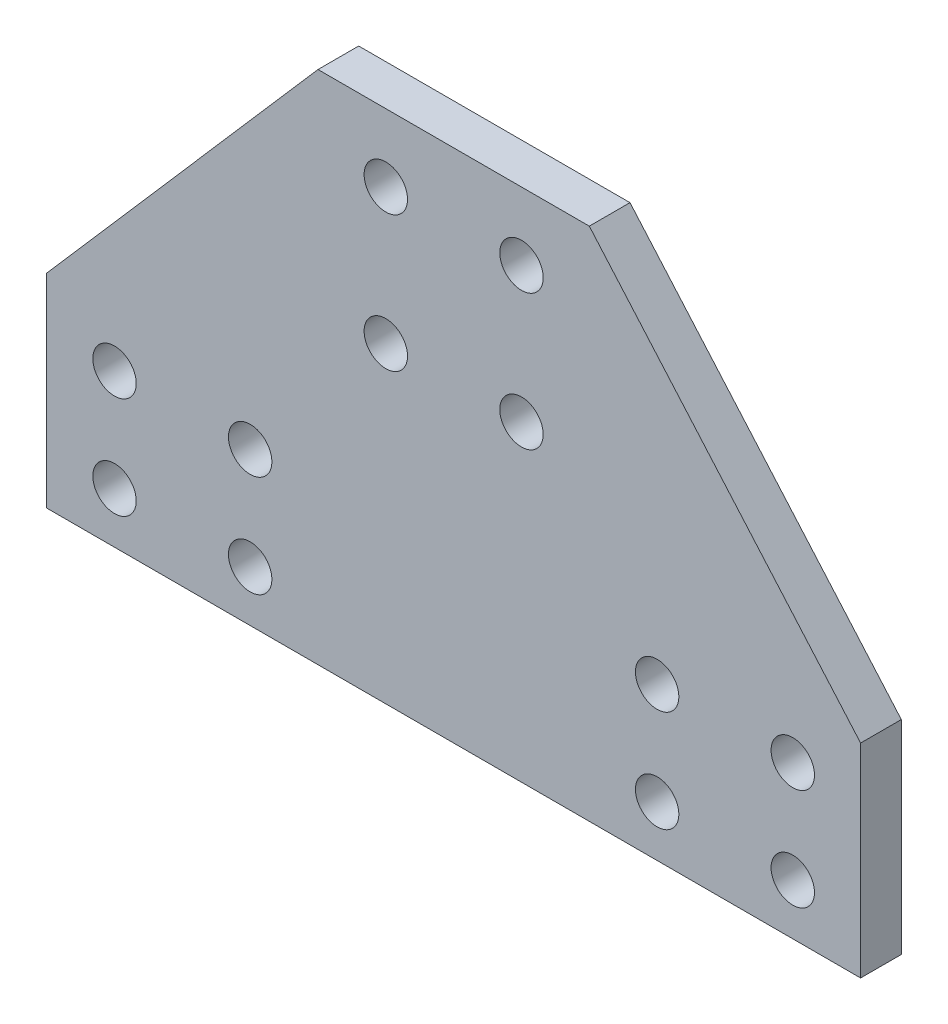
ISO-10303-21;
HEADER;
FILE_DESCRIPTION(('STEP AP214'),'2;1');
FILE_NAME('part.step','',(''),(''),'','','');
FILE_SCHEMA(('AUTOMOTIVE_DESIGN { 1 0 10303 214 1 1 1 1 }'));
ENDSEC;
DATA;
#1=APPLICATION_CONTEXT('core data for automotive mechanical design processes');
#2=APPLICATION_PROTOCOL_DEFINITION('international standard','automotive_design',2000,#1);
#3=PRODUCT_CONTEXT('',#1,'mechanical');
#4=PRODUCT('Part','Part','',(#3));
#5=PRODUCT_RELATED_PRODUCT_CATEGORY('part','',(#4));
#6=PRODUCT_DEFINITION_FORMATION('','',#4);
#7=PRODUCT_DEFINITION_CONTEXT('part definition',#1,'design');
#8=PRODUCT_DEFINITION('design','',#6,#7);
#9=PRODUCT_DEFINITION_SHAPE('','',#8);
#10=(LENGTH_UNIT() NAMED_UNIT(*) SI_UNIT(.MILLI.,.METRE.));
#11=(NAMED_UNIT(*) PLANE_ANGLE_UNIT() SI_UNIT($,.RADIAN.));
#12=(NAMED_UNIT(*) SI_UNIT($,.STERADIAN.) SOLID_ANGLE_UNIT());
#13=UNCERTAINTY_MEASURE_WITH_UNIT(LENGTH_MEASURE(1.E-05),#10,'distance_accuracy_value','');
#14=(GEOMETRIC_REPRESENTATION_CONTEXT(3) GLOBAL_UNCERTAINTY_ASSIGNED_CONTEXT((#13)) GLOBAL_UNIT_ASSIGNED_CONTEXT((#10,
#11,#12)) REPRESENTATION_CONTEXT('',''));
#15=CARTESIAN_POINT('',(0.,0.,0.));
#16=DIRECTION('',(0.,0.,1.));
#17=DIRECTION('',(1.,0.,0.));
#18=AXIS2_PLACEMENT_3D('',#15,#16,#17);
#19=CARTESIAN_POINT('',(-20.,-23.,3.));
#20=DIRECTION('',(0.754605522163505,-0.656178714924786,0.));
#21=DIRECTION('',(0.656178714924786,0.754605522163505,0.));
#22=AXIS2_PLACEMENT_3D('',#19,#20,#21);
#23=PLANE('',#22);
#24=DIRECTION('',(-0.656178714924787,-0.754605522163505,0.));
#25=VECTOR('',#24,1.);
#26=CARTESIAN_POINT('',(-20.,-23.,0.));
#27=LINE('',#26,#25);
#28=CARTESIAN_POINT('',(0.,0.,0.));
#29=VERTEX_POINT('',#28);
#30=CARTESIAN_POINT('',(-20.,-23.,0.));
#31=VERTEX_POINT('',#30);
#32=EDGE_CURVE('E132',#29,#31,#27,.T.);
#33=ORIENTED_EDGE('',*,*,#32,.T.);
#34=DIRECTION('',(0.,0.,-1.));
#35=VECTOR('',#34,1.);
#36=CARTESIAN_POINT('',(-20.,-23.,3.));
#37=LINE('',#36,#35);
#38=CARTESIAN_POINT('',(-20.,-23.,3.));
#39=VERTEX_POINT('',#38);
#40=EDGE_CURVE('E11',#39,#31,#37,.T.);
#41=ORIENTED_EDGE('',*,*,#40,.F.);
#42=DIRECTION('',(-0.656178714924787,-0.754605522163505,0.));
#43=VECTOR('',#42,1.);
#44=CARTESIAN_POINT('',(-20.,-23.,3.));
#45=LINE('',#44,#43);
#46=CARTESIAN_POINT('',(0.,0.,3.));
#47=VERTEX_POINT('',#46);
#48=EDGE_CURVE('E149',#47,#39,#45,.T.);
#49=ORIENTED_EDGE('',*,*,#48,.F.);
#50=DIRECTION('',(0.,0.,-1.));
#51=VECTOR('',#50,1.);
#52=CARTESIAN_POINT('',(0.,0.,3.));
#53=LINE('',#52,#51);
#54=EDGE_CURVE('E128',#47,#29,#53,.T.);
#55=ORIENTED_EDGE('',*,*,#54,.T.);
#56=EDGE_LOOP('',(#33,#41,#49,#55));
#57=FACE_BOUND('',#56,.T.);
#58=ADVANCED_FACE('F43',(#57),#23,.F.);
#59=CARTESIAN_POINT('',(-20.,-38.,3.));
#60=DIRECTION('',(1.,0.,0.));
#61=DIRECTION('',(0.,0.,-1.));
#62=AXIS2_PLACEMENT_3D('',#59,#60,#61);
#63=PLANE('',#62);
#64=DIRECTION('',(0.,-1.,0.));
#65=VECTOR('',#64,1.);
#66=CARTESIAN_POINT('',(-20.,-38.,0.));
#67=LINE('',#66,#65);
#68=CARTESIAN_POINT('',(-20.,-38.,0.));
#69=VERTEX_POINT('',#68);
#70=EDGE_CURVE('E136',#31,#69,#67,.T.);
#71=ORIENTED_EDGE('',*,*,#70,.T.);
#72=DIRECTION('',(0.,0.,-1.));
#73=VECTOR('',#72,1.);
#74=CARTESIAN_POINT('',(-20.,-38.,3.));
#75=LINE('',#74,#73);
#76=CARTESIAN_POINT('',(-20.,-38.,3.));
#77=VERTEX_POINT('',#76);
#78=EDGE_CURVE('E52',#77,#69,#75,.T.);
#79=ORIENTED_EDGE('',*,*,#78,.F.);
#80=DIRECTION('',(0.,-1.,0.));
#81=VECTOR('',#80,1.);
#82=CARTESIAN_POINT('',(-20.,-38.,3.));
#83=LINE('',#82,#81);
#84=EDGE_CURVE('E97',#39,#77,#83,.T.);
#85=ORIENTED_EDGE('',*,*,#84,.F.);
#86=ORIENTED_EDGE('',*,*,#40,.T.);
#87=EDGE_LOOP('',(#71,#79,#85,#86));
#88=FACE_BOUND('',#87,.T.);
#89=ADVANCED_FACE('F178',(#88),#63,.F.);
#90=CARTESIAN_POINT('',(40.,-38.,3.));
#91=DIRECTION('',(0.,1.,0.));
#92=DIRECTION('',(-1.,0.,0.));
#93=AXIS2_PLACEMENT_3D('',#90,#91,#92);
#94=PLANE('',#93);
#95=DIRECTION('',(1.,0.,0.));
#96=VECTOR('',#95,1.);
#97=CARTESIAN_POINT('',(40.,-38.,0.));
#98=LINE('',#97,#96);
#99=CARTESIAN_POINT('',(40.,-38.,0.));
#100=VERTEX_POINT('',#99);
#101=EDGE_CURVE('E140',#69,#100,#98,.T.);
#102=ORIENTED_EDGE('',*,*,#101,.T.);
#103=DIRECTION('',(0.,0.,-1.));
#104=VECTOR('',#103,1.);
#105=CARTESIAN_POINT('',(40.,-38.,3.));
#106=LINE('',#105,#104);
#107=CARTESIAN_POINT('',(40.,-38.,3.));
#108=VERTEX_POINT('',#107);
#109=EDGE_CURVE('E121',#108,#100,#106,.T.);
#110=ORIENTED_EDGE('',*,*,#109,.F.);
#111=DIRECTION('',(1.,0.,0.));
#112=VECTOR('',#111,1.);
#113=CARTESIAN_POINT('',(40.,-38.,3.));
#114=LINE('',#113,#112);
#115=EDGE_CURVE('E110',#77,#108,#114,.T.);
#116=ORIENTED_EDGE('',*,*,#115,.F.);
#117=ORIENTED_EDGE('',*,*,#78,.T.);
#118=EDGE_LOOP('',(#102,#110,#116,#117));
#119=FACE_BOUND('',#118,.T.);
#120=ADVANCED_FACE('F159',(#119),#94,.F.);
#121=CARTESIAN_POINT('',(40.,-23.,3.));
#122=DIRECTION('',(-1.,0.,0.));
#123=DIRECTION('',(0.,-1.,0.));
#124=AXIS2_PLACEMENT_3D('',#121,#122,#123);
#125=PLANE('',#124);
#126=DIRECTION('',(0.,1.,0.));
#127=VECTOR('',#126,1.);
#128=CARTESIAN_POINT('',(40.,-23.,0.));
#129=LINE('',#128,#127);
#130=CARTESIAN_POINT('',(40.,-23.,0.));
#131=VERTEX_POINT('',#130);
#132=EDGE_CURVE('E119',#100,#131,#129,.T.);
#133=ORIENTED_EDGE('',*,*,#132,.T.);
#134=DIRECTION('',(0.,0.,-1.));
#135=VECTOR('',#134,1.);
#136=CARTESIAN_POINT('',(40.,-23.,3.));
#137=LINE('',#136,#135);
#138=CARTESIAN_POINT('',(40.,-23.,3.));
#139=VERTEX_POINT('',#138);
#140=EDGE_CURVE('E116',#139,#131,#137,.T.);
#141=ORIENTED_EDGE('',*,*,#140,.F.);
#142=DIRECTION('',(0.,1.,0.));
#143=VECTOR('',#142,1.);
#144=CARTESIAN_POINT('',(40.,-23.,3.));
#145=LINE('',#144,#143);
#146=EDGE_CURVE('E104',#108,#139,#145,.T.);
#147=ORIENTED_EDGE('',*,*,#146,.F.);
#148=ORIENTED_EDGE('',*,*,#109,.T.);
#149=EDGE_LOOP('',(#133,#141,#147,#148));
#150=FACE_BOUND('',#149,.T.);
#151=ADVANCED_FACE('F117',(#150),#125,.F.);
#152=CARTESIAN_POINT('',(20.,0.,3.));
#153=DIRECTION('',(-0.754605522163505,-0.656178714924786,0.));
#154=DIRECTION('',(0.656178714924786,-0.754605522163505,0.));
#155=AXIS2_PLACEMENT_3D('',#152,#153,#154);
#156=PLANE('',#155);
#157=DIRECTION('',(-0.656178714924787,0.754605522163505,0.));
#158=VECTOR('',#157,1.);
#159=CARTESIAN_POINT('',(20.,0.,0.));
#160=LINE('',#159,#158);
#161=CARTESIAN_POINT('',(20.,0.,0.));
#162=VERTEX_POINT('',#161);
#163=EDGE_CURVE('E83',#131,#162,#160,.T.);
#164=ORIENTED_EDGE('',*,*,#163,.T.);
#165=DIRECTION('',(0.,0.,-1.));
#166=VECTOR('',#165,1.);
#167=CARTESIAN_POINT('',(20.,0.,3.));
#168=LINE('',#167,#166);
#169=CARTESIAN_POINT('',(20.,0.,3.));
#170=VERTEX_POINT('',#169);
#171=EDGE_CURVE('E122',#170,#162,#168,.T.);
#172=ORIENTED_EDGE('',*,*,#171,.F.);
#173=DIRECTION('',(-0.656178714924787,0.754605522163505,0.));
#174=VECTOR('',#173,1.);
#175=CARTESIAN_POINT('',(20.,0.,3.));
#176=LINE('',#175,#174);
#177=EDGE_CURVE('E108',#139,#170,#176,.T.);
#178=ORIENTED_EDGE('',*,*,#177,.F.);
#179=ORIENTED_EDGE('',*,*,#140,.T.);
#180=EDGE_LOOP('',(#164,#172,#178,#179));
#181=FACE_BOUND('',#180,.T.);
#182=ADVANCED_FACE('F124',(#181),#156,.F.);
#183=CARTESIAN_POINT('',(0.,0.,3.));
#184=DIRECTION('',(0.,-1.,0.));
#185=DIRECTION('',(1.,0.,0.));
#186=AXIS2_PLACEMENT_3D('',#183,#184,#185);
#187=PLANE('',#186);
#188=DIRECTION('',(-1.,0.,0.));
#189=VECTOR('',#188,1.);
#190=CARTESIAN_POINT('',(0.,0.,0.));
#191=LINE('',#190,#189);
#192=EDGE_CURVE('E89',#162,#29,#191,.T.);
#193=ORIENTED_EDGE('',*,*,#192,.T.);
#194=ORIENTED_EDGE('',*,*,#54,.F.);
#195=DIRECTION('',(-1.,0.,0.));
#196=VECTOR('',#195,1.);
#197=CARTESIAN_POINT('',(0.,0.,3.));
#198=LINE('',#197,#196);
#199=EDGE_CURVE('E60',#170,#47,#198,.T.);
#200=ORIENTED_EDGE('',*,*,#199,.F.);
#201=ORIENTED_EDGE('',*,*,#171,.T.);
#202=EDGE_LOOP('',(#193,#194,#200,#201));
#203=FACE_BOUND('',#202,.T.);
#204=ADVANCED_FACE('F166',(#203),#187,.F.);
#205=CARTESIAN_POINT('',(0.,0.,3.));
#206=DIRECTION('',(0.,0.,-1.));
#207=DIRECTION('',(-1.,0.,0.));
#208=AXIS2_PLACEMENT_3D('',#205,#206,#207);
#209=PLANE('',#208);
#210=CARTESIAN_POINT('',(35.,-34.25,3.));
#211=DIRECTION('',(0.,0.,1.));
#212=DIRECTION('',(-1.,0.,0.));
#213=AXIS2_PLACEMENT_3D('',#210,#211,#212);
#214=CIRCLE('',#213,1.6);
#215=CARTESIAN_POINT('',(33.4,-34.25,3.));
#216=VERTEX_POINT('',#215);
#217=EDGE_CURVE('E398',#216,#216,#214,.T.);
#218=ORIENTED_EDGE('',*,*,#217,.F.);
#219=EDGE_LOOP('',(#218));
#220=FACE_BOUND('',#219,.T.);
#221=CARTESIAN_POINT('',(25.,-26.75,3.));
#222=DIRECTION('',(0.,0.,1.));
#223=DIRECTION('',(-1.,0.,0.));
#224=AXIS2_PLACEMENT_3D('',#221,#222,#223);
#225=CIRCLE('',#224,1.6);
#226=CARTESIAN_POINT('',(23.4,-26.75,3.));
#227=VERTEX_POINT('',#226);
#228=EDGE_CURVE('E407',#227,#227,#225,.T.);
#229=ORIENTED_EDGE('',*,*,#228,.F.);
#230=EDGE_LOOP('',(#229));
#231=FACE_BOUND('',#230,.T.);
#232=CARTESIAN_POINT('',(35.,-26.75,3.));
#233=DIRECTION('',(0.,0.,1.));
#234=DIRECTION('',(1.,0.,0.));
#235=AXIS2_PLACEMENT_3D('',#232,#233,#234);
#236=CIRCLE('',#235,1.6);
#237=CARTESIAN_POINT('',(36.6,-26.75,3.));
#238=VERTEX_POINT('',#237);
#239=EDGE_CURVE('E420',#238,#238,#236,.T.);
#240=ORIENTED_EDGE('',*,*,#239,.F.);
#241=EDGE_LOOP('',(#240));
#242=FACE_BOUND('',#241,.T.);
#243=CARTESIAN_POINT('',(5.,-5.,3.));
#244=DIRECTION('',(0.,0.,1.));
#245=DIRECTION('',(1.,0.,0.));
#246=AXIS2_PLACEMENT_3D('',#243,#244,#245);
#247=CIRCLE('',#246,1.6);
#248=CARTESIAN_POINT('',(6.6,-5.,3.));
#249=VERTEX_POINT('',#248);
#250=EDGE_CURVE('E505',#249,#249,#247,.T.);
#251=ORIENTED_EDGE('',*,*,#250,.F.);
#252=EDGE_LOOP('',(#251));
#253=FACE_BOUND('',#252,.T.);
#254=CARTESIAN_POINT('',(-15.,-26.75,3.));
#255=DIRECTION('',(0.,0.,1.));
#256=DIRECTION('',(-1.,0.,0.));
#257=AXIS2_PLACEMENT_3D('',#254,#255,#256);
#258=CIRCLE('',#257,1.6);
#259=CARTESIAN_POINT('',(-16.6,-26.75,3.));
#260=VERTEX_POINT('',#259);
#261=EDGE_CURVE('E433',#260,#260,#258,.T.);
#262=ORIENTED_EDGE('',*,*,#261,.F.);
#263=EDGE_LOOP('',(#262));
#264=FACE_BOUND('',#263,.T.);
#265=CARTESIAN_POINT('',(-4.99999999999999,-34.25,3.));
#266=DIRECTION('',(0.,0.,1.));
#267=DIRECTION('',(-1.,0.,0.));
#268=AXIS2_PLACEMENT_3D('',#265,#266,#267);
#269=CIRCLE('',#268,1.6);
#270=CARTESIAN_POINT('',(-6.59999999999998,-34.25,3.));
#271=VERTEX_POINT('',#270);
#272=EDGE_CURVE('E442',#271,#271,#269,.T.);
#273=ORIENTED_EDGE('',*,*,#272,.F.);
#274=EDGE_LOOP('',(#273));
#275=FACE_BOUND('',#274,.T.);
#276=CARTESIAN_POINT('',(-4.99999999999998,-26.75,3.));
#277=DIRECTION('',(0.,0.,1.));
#278=DIRECTION('',(1.,0.,0.));
#279=AXIS2_PLACEMENT_3D('',#276,#277,#278);
#280=CIRCLE('',#279,1.6);
#281=CARTESIAN_POINT('',(-3.39999999999999,-26.75,3.));
#282=VERTEX_POINT('',#281);
#283=EDGE_CURVE('E421',#282,#282,#280,.T.);
#284=ORIENTED_EDGE('',*,*,#283,.F.);
#285=EDGE_LOOP('',(#284));
#286=FACE_BOUND('',#285,.T.);
#287=CARTESIAN_POINT('',(25.,-34.25,3.));
#288=DIRECTION('',(0.,0.,1.));
#289=DIRECTION('',(1.,0.,0.));
#290=AXIS2_PLACEMENT_3D('',#287,#288,#289);
#291=CIRCLE('',#290,1.59999999999999);
#292=CARTESIAN_POINT('',(26.6,-34.25,3.));
#293=VERTEX_POINT('',#292);
#294=EDGE_CURVE('E405',#293,#293,#291,.T.);
#295=ORIENTED_EDGE('',*,*,#294,.F.);
#296=EDGE_LOOP('',(#295));
#297=FACE_BOUND('',#296,.T.);
#298=CARTESIAN_POINT('',(15.,-5.,3.));
#299=DIRECTION('',(0.,0.,1.));
#300=DIRECTION('',(-1.,0.,0.));
#301=AXIS2_PLACEMENT_3D('',#298,#299,#300);
#302=CIRCLE('',#301,1.6);
#303=CARTESIAN_POINT('',(13.4,-5.,3.));
#304=VERTEX_POINT('',#303);
#305=EDGE_CURVE('E478',#304,#304,#302,.T.);
#306=ORIENTED_EDGE('',*,*,#305,.F.);
#307=EDGE_LOOP('',(#306));
#308=FACE_BOUND('',#307,.T.);
#309=CARTESIAN_POINT('',(15.,-15.,3.));
#310=DIRECTION('',(0.,0.,1.));
#311=DIRECTION('',(1.,0.,0.));
#312=AXIS2_PLACEMENT_3D('',#309,#310,#311);
#313=CIRCLE('',#312,1.6);
#314=CARTESIAN_POINT('',(16.6,-15.,3.));
#315=VERTEX_POINT('',#314);
#316=EDGE_CURVE('E482',#315,#315,#313,.T.);
#317=ORIENTED_EDGE('',*,*,#316,.F.);
#318=EDGE_LOOP('',(#317));
#319=FACE_BOUND('',#318,.T.);
#320=CARTESIAN_POINT('',(5.,-15.,3.));
#321=DIRECTION('',(0.,0.,1.));
#322=DIRECTION('',(-1.,0.,0.));
#323=AXIS2_PLACEMENT_3D('',#320,#321,#322);
#324=CIRCLE('',#323,1.6);
#325=CARTESIAN_POINT('',(3.4,-15.,3.));
#326=VERTEX_POINT('',#325);
#327=EDGE_CURVE('E485',#326,#326,#324,.T.);
#328=ORIENTED_EDGE('',*,*,#327,.F.);
#329=EDGE_LOOP('',(#328));
#330=FACE_BOUND('',#329,.T.);
#331=CARTESIAN_POINT('',(-15.,-34.25,3.));
#332=DIRECTION('',(0.,0.,1.));
#333=DIRECTION('',(1.,0.,0.));
#334=AXIS2_PLACEMENT_3D('',#331,#332,#333);
#335=CIRCLE('',#334,1.6);
#336=CARTESIAN_POINT('',(-13.4,-34.25,3.));
#337=VERTEX_POINT('',#336);
#338=EDGE_CURVE('E437',#337,#337,#335,.T.);
#339=ORIENTED_EDGE('',*,*,#338,.F.);
#340=EDGE_LOOP('',(#339));
#341=FACE_BOUND('',#340,.T.);
#342=ORIENTED_EDGE('',*,*,#48,.T.);
#343=ORIENTED_EDGE('',*,*,#84,.T.);
#344=ORIENTED_EDGE('',*,*,#115,.T.);
#345=ORIENTED_EDGE('',*,*,#146,.T.);
#346=ORIENTED_EDGE('',*,*,#177,.T.);
#347=ORIENTED_EDGE('',*,*,#199,.T.);
#348=EDGE_LOOP('',(#342,#343,#344,#345,#346,#347));
#349=FACE_BOUND('',#348,.T.);
#350=ADVANCED_FACE('F106',(#220,#231,#242,#253,#264,#275,#286,#297,#308,#319,#330,#341,#349),
#209,.F.);
#351=CARTESIAN_POINT('',(0.,0.,0.));
#352=DIRECTION('',(0.,0.,-1.));
#353=DIRECTION('',(-1.,0.,0.));
#354=AXIS2_PLACEMENT_3D('',#351,#352,#353);
#355=PLANE('',#354);
#356=CARTESIAN_POINT('',(35.,-34.25,0.));
#357=DIRECTION('',(0.,0.,1.));
#358=DIRECTION('',(-1.,0.,0.));
#359=AXIS2_PLACEMENT_3D('',#356,#357,#358);
#360=CIRCLE('',#359,1.6);
#361=CARTESIAN_POINT('',(33.4,-34.25,0.));
#362=VERTEX_POINT('',#361);
#363=EDGE_CURVE('E395',#362,#362,#360,.T.);
#364=ORIENTED_EDGE('',*,*,#363,.T.);
#365=EDGE_LOOP('',(#364));
#366=FACE_BOUND('',#365,.T.);
#367=CARTESIAN_POINT('',(25.,-26.75,0.));
#368=DIRECTION('',(0.,0.,1.));
#369=DIRECTION('',(-1.,0.,0.));
#370=AXIS2_PLACEMENT_3D('',#367,#368,#369);
#371=CIRCLE('',#370,1.6);
#372=CARTESIAN_POINT('',(23.4,-26.75,0.));
#373=VERTEX_POINT('',#372);
#374=EDGE_CURVE('E416',#373,#373,#371,.T.);
#375=ORIENTED_EDGE('',*,*,#374,.T.);
#376=EDGE_LOOP('',(#375));
#377=FACE_BOUND('',#376,.T.);
#378=CARTESIAN_POINT('',(35.,-26.75,0.));
#379=DIRECTION('',(0.,0.,1.));
#380=DIRECTION('',(1.,0.,0.));
#381=AXIS2_PLACEMENT_3D('',#378,#379,#380);
#382=CIRCLE('',#381,1.6);
#383=CARTESIAN_POINT('',(36.6,-26.75,0.));
#384=VERTEX_POINT('',#383);
#385=EDGE_CURVE('E502',#384,#384,#382,.T.);
#386=ORIENTED_EDGE('',*,*,#385,.T.);
#387=EDGE_LOOP('',(#386));
#388=FACE_BOUND('',#387,.T.);
#389=CARTESIAN_POINT('',(5.,-5.,0.));
#390=DIRECTION('',(0.,0.,1.));
#391=DIRECTION('',(1.,0.,0.));
#392=AXIS2_PLACEMENT_3D('',#389,#390,#391);
#393=CIRCLE('',#392,1.6);
#394=CARTESIAN_POINT('',(6.6,-5.,0.));
#395=VERTEX_POINT('',#394);
#396=EDGE_CURVE('E410',#395,#395,#393,.T.);
#397=ORIENTED_EDGE('',*,*,#396,.T.);
#398=EDGE_LOOP('',(#397));
#399=FACE_BOUND('',#398,.T.);
#400=CARTESIAN_POINT('',(-15.,-26.75,0.));
#401=DIRECTION('',(0.,0.,1.));
#402=DIRECTION('',(-1.,0.,0.));
#403=AXIS2_PLACEMENT_3D('',#400,#401,#402);
#404=CIRCLE('',#403,1.6);
#405=CARTESIAN_POINT('',(-16.6,-26.75,0.));
#406=VERTEX_POINT('',#405);
#407=EDGE_CURVE('E438',#406,#406,#404,.T.);
#408=ORIENTED_EDGE('',*,*,#407,.T.);
#409=EDGE_LOOP('',(#408));
#410=FACE_BOUND('',#409,.T.);
#411=CARTESIAN_POINT('',(-4.99999999999999,-34.25,0.));
#412=DIRECTION('',(0.,0.,1.));
#413=DIRECTION('',(-1.,0.,0.));
#414=AXIS2_PLACEMENT_3D('',#411,#412,#413);
#415=CIRCLE('',#414,1.6);
#416=CARTESIAN_POINT('',(-6.59999999999998,-34.25,0.));
#417=VERTEX_POINT('',#416);
#418=EDGE_CURVE('E425',#417,#417,#415,.T.);
#419=ORIENTED_EDGE('',*,*,#418,.T.);
#420=EDGE_LOOP('',(#419));
#421=FACE_BOUND('',#420,.T.);
#422=CARTESIAN_POINT('',(-4.99999999999998,-26.75,0.));
#423=DIRECTION('',(0.,0.,1.));
#424=DIRECTION('',(1.,0.,0.));
#425=AXIS2_PLACEMENT_3D('',#422,#423,#424);
#426=CIRCLE('',#425,1.6);
#427=CARTESIAN_POINT('',(-3.39999999999999,-26.75,0.));
#428=VERTEX_POINT('',#427);
#429=EDGE_CURVE('E426',#428,#428,#426,.T.);
#430=ORIENTED_EDGE('',*,*,#429,.T.);
#431=EDGE_LOOP('',(#430));
#432=FACE_BOUND('',#431,.T.);
#433=CARTESIAN_POINT('',(25.,-34.25,0.));
#434=DIRECTION('',(0.,0.,1.));
#435=DIRECTION('',(1.,0.,0.));
#436=AXIS2_PLACEMENT_3D('',#433,#434,#435);
#437=CIRCLE('',#436,1.59999999999999);
#438=CARTESIAN_POINT('',(26.6,-34.25,0.));
#439=VERTEX_POINT('',#438);
#440=EDGE_CURVE('E400',#439,#439,#437,.T.);
#441=ORIENTED_EDGE('',*,*,#440,.T.);
#442=EDGE_LOOP('',(#441));
#443=FACE_BOUND('',#442,.T.);
#444=CARTESIAN_POINT('',(15.,-5.,0.));
#445=DIRECTION('',(0.,0.,1.));
#446=DIRECTION('',(-1.,0.,0.));
#447=AXIS2_PLACEMENT_3D('',#444,#445,#446);
#448=CIRCLE('',#447,1.6);
#449=CARTESIAN_POINT('',(13.4,-5.,0.));
#450=VERTEX_POINT('',#449);
#451=EDGE_CURVE('E515',#450,#450,#448,.T.);
#452=ORIENTED_EDGE('',*,*,#451,.T.);
#453=EDGE_LOOP('',(#452));
#454=FACE_BOUND('',#453,.T.);
#455=CARTESIAN_POINT('',(15.,-15.,0.));
#456=DIRECTION('',(0.,0.,1.));
#457=DIRECTION('',(1.,0.,0.));
#458=AXIS2_PLACEMENT_3D('',#455,#456,#457);
#459=CIRCLE('',#458,1.6);
#460=CARTESIAN_POINT('',(16.6,-15.,0.));
#461=VERTEX_POINT('',#460);
#462=EDGE_CURVE('E488',#461,#461,#459,.T.);
#463=ORIENTED_EDGE('',*,*,#462,.T.);
#464=EDGE_LOOP('',(#463));
#465=FACE_BOUND('',#464,.T.);
#466=CARTESIAN_POINT('',(5.,-15.,0.));
#467=DIRECTION('',(0.,0.,1.));
#468=DIRECTION('',(-1.,0.,0.));
#469=AXIS2_PLACEMENT_3D('',#466,#467,#468);
#470=CIRCLE('',#469,1.6);
#471=CARTESIAN_POINT('',(3.4,-15.,0.));
#472=VERTEX_POINT('',#471);
#473=EDGE_CURVE('E489',#472,#472,#470,.T.);
#474=ORIENTED_EDGE('',*,*,#473,.T.);
#475=EDGE_LOOP('',(#474));
#476=FACE_BOUND('',#475,.T.);
#477=CARTESIAN_POINT('',(-15.,-34.25,0.));
#478=DIRECTION('',(0.,0.,1.));
#479=DIRECTION('',(1.,0.,0.));
#480=AXIS2_PLACEMENT_3D('',#477,#478,#479);
#481=CIRCLE('',#480,1.6);
#482=CARTESIAN_POINT('',(-13.4,-34.25,0.));
#483=VERTEX_POINT('',#482);
#484=EDGE_CURVE('E137',#483,#483,#481,.T.);
#485=ORIENTED_EDGE('',*,*,#484,.T.);
#486=EDGE_LOOP('',(#485));
#487=FACE_BOUND('',#486,.T.);
#488=ORIENTED_EDGE('',*,*,#32,.F.);
#489=ORIENTED_EDGE('',*,*,#192,.F.);
#490=ORIENTED_EDGE('',*,*,#163,.F.);
#491=ORIENTED_EDGE('',*,*,#132,.F.);
#492=ORIENTED_EDGE('',*,*,#101,.F.);
#493=ORIENTED_EDGE('',*,*,#70,.F.);
#494=EDGE_LOOP('',(#488,#489,#490,#491,#492,#493));
#495=FACE_BOUND('',#494,.T.);
#496=ADVANCED_FACE('F162',(#366,#377,#388,#399,#410,#421,#432,#443,#454,#465,#476,#487,#495),
#355,.T.);
#497=CARTESIAN_POINT('',(-15.,-34.25,0.));
#498=DIRECTION('',(0.,0.,1.));
#499=DIRECTION('',(1.,0.,0.));
#500=AXIS2_PLACEMENT_3D('',#497,#498,#499);
#501=CYLINDRICAL_SURFACE('',#500,1.6);
#502=ORIENTED_EDGE('',*,*,#484,.F.);
#503=EDGE_LOOP('',(#502));
#504=FACE_BOUND('',#503,.T.);
#505=ORIENTED_EDGE('',*,*,#338,.T.);
#506=EDGE_LOOP('',(#505));
#507=FACE_BOUND('',#506,.T.);
#508=ADVANCED_FACE('F218',(#504,#507),#501,.F.);
#509=CARTESIAN_POINT('',(5.,-15.,0.));
#510=DIRECTION('',(0.,0.,1.));
#511=DIRECTION('',(1.,0.,0.));
#512=AXIS2_PLACEMENT_3D('',#509,#510,#511);
#513=CYLINDRICAL_SURFACE('',#512,1.6);
#514=ORIENTED_EDGE('',*,*,#473,.F.);
#515=EDGE_LOOP('',(#514));
#516=FACE_BOUND('',#515,.T.);
#517=ORIENTED_EDGE('',*,*,#327,.T.);
#518=EDGE_LOOP('',(#517));
#519=FACE_BOUND('',#518,.T.);
#520=ADVANCED_FACE('F228',(#516,#519),#513,.F.);
#521=CARTESIAN_POINT('',(15.,-15.,0.));
#522=DIRECTION('',(0.,0.,1.));
#523=DIRECTION('',(1.,0.,0.));
#524=AXIS2_PLACEMENT_3D('',#521,#522,#523);
#525=CYLINDRICAL_SURFACE('',#524,1.6);
#526=ORIENTED_EDGE('',*,*,#462,.F.);
#527=EDGE_LOOP('',(#526));
#528=FACE_BOUND('',#527,.T.);
#529=ORIENTED_EDGE('',*,*,#316,.T.);
#530=EDGE_LOOP('',(#529));
#531=FACE_BOUND('',#530,.T.);
#532=ADVANCED_FACE('F239',(#528,#531),#525,.F.);
#533=CARTESIAN_POINT('',(15.,-5.,0.));
#534=DIRECTION('',(0.,0.,1.));
#535=DIRECTION('',(1.,0.,0.));
#536=AXIS2_PLACEMENT_3D('',#533,#534,#535);
#537=CYLINDRICAL_SURFACE('',#536,1.6);
#538=ORIENTED_EDGE('',*,*,#451,.F.);
#539=EDGE_LOOP('',(#538));
#540=FACE_BOUND('',#539,.T.);
#541=ORIENTED_EDGE('',*,*,#305,.T.);
#542=EDGE_LOOP('',(#541));
#543=FACE_BOUND('',#542,.T.);
#544=ADVANCED_FACE('F250',(#540,#543),#537,.F.);
#545=CARTESIAN_POINT('',(25.,-34.25,0.));
#546=DIRECTION('',(0.,0.,1.));
#547=DIRECTION('',(1.,0.,0.));
#548=AXIS2_PLACEMENT_3D('',#545,#546,#547);
#549=CYLINDRICAL_SURFACE('',#548,1.59999999999999);
#550=ORIENTED_EDGE('',*,*,#440,.F.);
#551=EDGE_LOOP('',(#550));
#552=FACE_BOUND('',#551,.T.);
#553=ORIENTED_EDGE('',*,*,#294,.T.);
#554=EDGE_LOOP('',(#553));
#555=FACE_BOUND('',#554,.T.);
#556=ADVANCED_FACE('F261',(#552,#555),#549,.F.);
#557=CARTESIAN_POINT('',(-4.99999999999998,-26.75,0.));
#558=DIRECTION('',(0.,0.,1.));
#559=DIRECTION('',(1.,0.,0.));
#560=AXIS2_PLACEMENT_3D('',#557,#558,#559);
#561=CYLINDRICAL_SURFACE('',#560,1.6);
#562=ORIENTED_EDGE('',*,*,#429,.F.);
#563=EDGE_LOOP('',(#562));
#564=FACE_BOUND('',#563,.T.);
#565=ORIENTED_EDGE('',*,*,#283,.T.);
#566=EDGE_LOOP('',(#565));
#567=FACE_BOUND('',#566,.T.);
#568=ADVANCED_FACE('F272',(#564,#567),#561,.F.);
#569=CARTESIAN_POINT('',(-4.99999999999999,-34.25,0.));
#570=DIRECTION('',(0.,0.,1.));
#571=DIRECTION('',(1.,0.,0.));
#572=AXIS2_PLACEMENT_3D('',#569,#570,#571);
#573=CYLINDRICAL_SURFACE('',#572,1.6);
#574=ORIENTED_EDGE('',*,*,#418,.F.);
#575=EDGE_LOOP('',(#574));
#576=FACE_BOUND('',#575,.T.);
#577=ORIENTED_EDGE('',*,*,#272,.T.);
#578=EDGE_LOOP('',(#577));
#579=FACE_BOUND('',#578,.T.);
#580=ADVANCED_FACE('F283',(#576,#579),#573,.F.);
#581=CARTESIAN_POINT('',(-15.,-26.75,0.));
#582=DIRECTION('',(0.,0.,1.));
#583=DIRECTION('',(1.,0.,0.));
#584=AXIS2_PLACEMENT_3D('',#581,#582,#583);
#585=CYLINDRICAL_SURFACE('',#584,1.6);
#586=ORIENTED_EDGE('',*,*,#407,.F.);
#587=EDGE_LOOP('',(#586));
#588=FACE_BOUND('',#587,.T.);
#589=ORIENTED_EDGE('',*,*,#261,.T.);
#590=EDGE_LOOP('',(#589));
#591=FACE_BOUND('',#590,.T.);
#592=ADVANCED_FACE('F294',(#588,#591),#585,.F.);
#593=CARTESIAN_POINT('',(5.,-5.,0.));
#594=DIRECTION('',(0.,0.,1.));
#595=DIRECTION('',(1.,0.,0.));
#596=AXIS2_PLACEMENT_3D('',#593,#594,#595);
#597=CYLINDRICAL_SURFACE('',#596,1.6);
#598=ORIENTED_EDGE('',*,*,#396,.F.);
#599=EDGE_LOOP('',(#598));
#600=FACE_BOUND('',#599,.T.);
#601=ORIENTED_EDGE('',*,*,#250,.T.);
#602=EDGE_LOOP('',(#601));
#603=FACE_BOUND('',#602,.T.);
#604=ADVANCED_FACE('F305',(#600,#603),#597,.F.);
#605=CARTESIAN_POINT('',(35.,-26.75,0.));
#606=DIRECTION('',(0.,0.,1.));
#607=DIRECTION('',(1.,0.,0.));
#608=AXIS2_PLACEMENT_3D('',#605,#606,#607);
#609=CYLINDRICAL_SURFACE('',#608,1.6);
#610=ORIENTED_EDGE('',*,*,#385,.F.);
#611=EDGE_LOOP('',(#610));
#612=FACE_BOUND('',#611,.T.);
#613=ORIENTED_EDGE('',*,*,#239,.T.);
#614=EDGE_LOOP('',(#613));
#615=FACE_BOUND('',#614,.T.);
#616=ADVANCED_FACE('F316',(#612,#615),#609,.F.);
#617=CARTESIAN_POINT('',(25.,-26.75,0.));
#618=DIRECTION('',(0.,0.,1.));
#619=DIRECTION('',(1.,0.,0.));
#620=AXIS2_PLACEMENT_3D('',#617,#618,#619);
#621=CYLINDRICAL_SURFACE('',#620,1.6);
#622=ORIENTED_EDGE('',*,*,#374,.F.);
#623=EDGE_LOOP('',(#622));
#624=FACE_BOUND('',#623,.T.);
#625=ORIENTED_EDGE('',*,*,#228,.T.);
#626=EDGE_LOOP('',(#625));
#627=FACE_BOUND('',#626,.T.);
#628=ADVANCED_FACE('F327',(#624,#627),#621,.F.);
#629=CARTESIAN_POINT('',(35.,-34.25,0.));
#630=DIRECTION('',(0.,0.,1.));
#631=DIRECTION('',(1.,0.,0.));
#632=AXIS2_PLACEMENT_3D('',#629,#630,#631);
#633=CYLINDRICAL_SURFACE('',#632,1.6);
#634=ORIENTED_EDGE('',*,*,#363,.F.);
#635=EDGE_LOOP('',(#634));
#636=FACE_BOUND('',#635,.T.);
#637=ORIENTED_EDGE('',*,*,#217,.T.);
#638=EDGE_LOOP('',(#637));
#639=FACE_BOUND('',#638,.T.);
#640=ADVANCED_FACE('F338',(#636,#639),#633,.F.);
#641=CLOSED_SHELL('',(#58,#89,#120,#151,#182,#204,#350,#496,#508,#520,#532,#544,#556,#568,#580,
#592,#604,#616,#628,#640));
#642=MANIFOLD_SOLID_BREP('B2',#641);
#643=ADVANCED_BREP_SHAPE_REPRESENTATION('',(#18,#642),#14);
#644=SHAPE_DEFINITION_REPRESENTATION(#9,#643);
ENDSEC;
END-ISO-10303-21;
